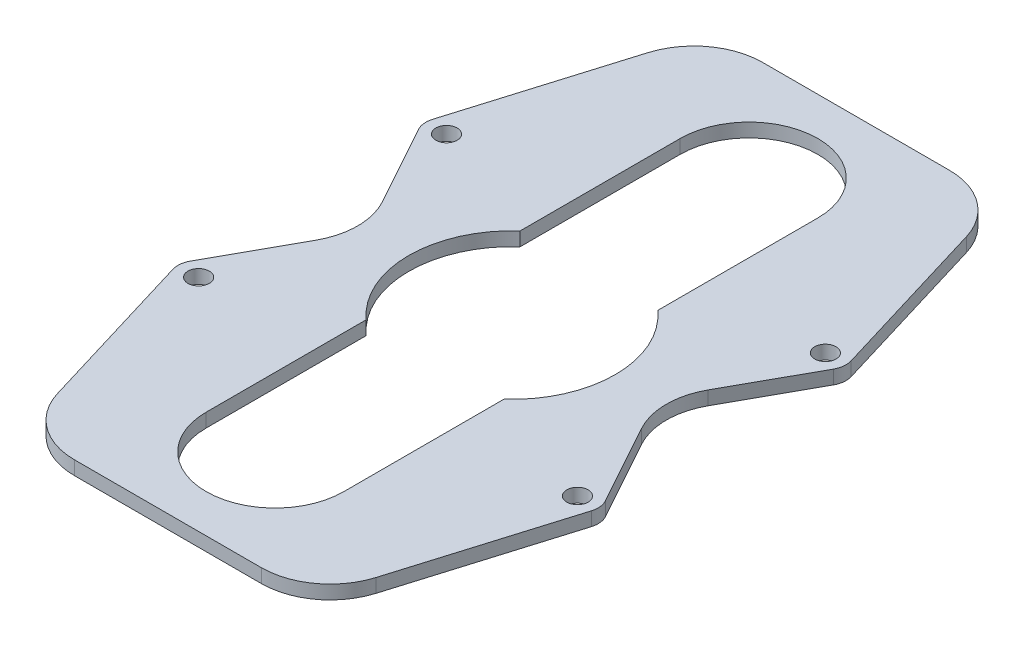
ISO-10303-21;
HEADER;
FILE_DESCRIPTION(('STEP AP214'),'2;1');
FILE_NAME('part.step','',(''),(''),'','','');
FILE_SCHEMA(('AUTOMOTIVE_DESIGN { 1 0 10303 214 1 1 1 1 }'));
ENDSEC;
DATA;
#1=APPLICATION_CONTEXT('core data for automotive mechanical design processes');
#2=APPLICATION_PROTOCOL_DEFINITION('international standard','automotive_design',2000,#1);
#3=PRODUCT_CONTEXT('',#1,'mechanical');
#4=PRODUCT('Part','Part','',(#3));
#5=PRODUCT_RELATED_PRODUCT_CATEGORY('part','',(#4));
#6=PRODUCT_DEFINITION_FORMATION('','',#4);
#7=PRODUCT_DEFINITION_CONTEXT('part definition',#1,'design');
#8=PRODUCT_DEFINITION('design','',#6,#7);
#9=PRODUCT_DEFINITION_SHAPE('','',#8);
#10=(LENGTH_UNIT() NAMED_UNIT(*) SI_UNIT(.MILLI.,.METRE.));
#11=(NAMED_UNIT(*) PLANE_ANGLE_UNIT() SI_UNIT($,.RADIAN.));
#12=(NAMED_UNIT(*) SI_UNIT($,.STERADIAN.) SOLID_ANGLE_UNIT());
#13=UNCERTAINTY_MEASURE_WITH_UNIT(LENGTH_MEASURE(1.E-05),#10,'distance_accuracy_value','');
#14=(GEOMETRIC_REPRESENTATION_CONTEXT(3) GLOBAL_UNCERTAINTY_ASSIGNED_CONTEXT((#13)) GLOBAL_UNIT_ASSIGNED_CONTEXT((#10,
#11,#12)) REPRESENTATION_CONTEXT('',''));
#15=CARTESIAN_POINT('',(0.,0.,0.));
#16=DIRECTION('',(0.,0.,1.));
#17=DIRECTION('',(1.,0.,0.));
#18=AXIS2_PLACEMENT_3D('',#15,#16,#17);
#19=CARTESIAN_POINT('',(-13.5734358663279,2.,-40.));
#20=DIRECTION('',(0.,1.,0.));
#21=DIRECTION('',(0.,0.,1.));
#22=AXIS2_PLACEMENT_3D('',#19,#20,#21);
#23=PLANE('',#22);
#24=CARTESIAN_POINT('',(27.525,2.,18.01));
#25=DIRECTION('',(0.,1.,0.));
#26=DIRECTION('',(0.,0.,1.));
#27=AXIS2_PLACEMENT_3D('',#24,#25,#26);
#28=CIRCLE('',#27,1.55);
#29=CARTESIAN_POINT('',(27.525,2.,19.56));
#30=VERTEX_POINT('',#29);
#31=EDGE_CURVE('E832',#30,#30,#28,.T.);
#32=ORIENTED_EDGE('',*,*,#31,.F.);
#33=EDGE_LOOP('',(#32));
#34=FACE_BOUND('',#33,.T.);
#35=CARTESIAN_POINT('',(-27.525,2.,-18.01));
#36=DIRECTION('',(0.,1.,0.));
#37=DIRECTION('',(0.,0.,1.));
#38=AXIS2_PLACEMENT_3D('',#35,#36,#37);
#39=CIRCLE('',#38,1.55);
#40=CARTESIAN_POINT('',(-27.525,2.,-16.46));
#41=VERTEX_POINT('',#40);
#42=EDGE_CURVE('E672',#41,#41,#39,.T.);
#43=ORIENTED_EDGE('',*,*,#42,.F.);
#44=EDGE_LOOP('',(#43));
#45=FACE_BOUND('',#44,.T.);
#46=CARTESIAN_POINT('',(-13.5734358663279,2.,-40.));
#47=DIRECTION('',(0.,1.,0.));
#48=DIRECTION('',(0.,0.,1.));
#49=AXIS2_PLACEMENT_3D('',#46,#47,#48);
#50=CIRCLE('',#49,10.);
#51=CARTESIAN_POINT('',(-13.5734358663279,2.,-50.));
#52=VERTEX_POINT('',#51);
#53=CARTESIAN_POINT('',(-23.1465968319195,2.,-42.8904306127067));
#54=VERTEX_POINT('',#53);
#55=EDGE_CURVE('E678',#52,#54,#50,.T.);
#56=ORIENTED_EDGE('',*,*,#55,.T.);
#57=DIRECTION('',(0.289043061270665,0.,-0.957316096559168));
#58=VECTOR('',#57,1.);
#59=CARTESIAN_POINT('',(-30.3969482896775,2.,-18.877129183812));
#60=LINE('',#59,#58);
#61=CARTESIAN_POINT('',(-30.3969482896775,2.,-18.877129183812));
#62=VERTEX_POINT('',#61);
#63=EDGE_CURVE('E680',#62,#54,#60,.T.);
#64=ORIENTED_EDGE('',*,*,#63,.F.);
#65=CARTESIAN_POINT('',(-27.525,2.,-18.01));
#66=DIRECTION('',(0.,-1.,0.));
#67=DIRECTION('',(0.,0.,-1.));
#68=AXIS2_PLACEMENT_3D('',#65,#66,#67);
#69=CIRCLE('',#68,3.);
#70=CARTESIAN_POINT('',(-30.1507426954991,2.,-16.5589743982159));
#71=VERTEX_POINT('',#70);
#72=EDGE_CURVE('E684',#71,#62,#69,.T.);
#73=ORIENTED_EDGE('',*,*,#72,.F.);
#74=DIRECTION('',(0.483675200594704,0.,0.875247565166378));
#75=VECTOR('',#74,1.);
#76=CARTESIAN_POINT('',(-30.1507426954991,2.,-16.5589743982159));
#77=LINE('',#76,#75);
#78=CARTESIAN_POINT('',(-23.6728631872955,2.,-4.83675200594703));
#79=VERTEX_POINT('',#78);
#80=EDGE_CURVE('E687',#71,#79,#77,.T.);
#81=ORIENTED_EDGE('',*,*,#80,.T.);
#82=CARTESIAN_POINT('',(-32.4253388389593,2.,0.));
#83=DIRECTION('',(0.,1.,0.));
#84=DIRECTION('',(0.,0.,1.));
#85=AXIS2_PLACEMENT_3D('',#82,#83,#84);
#86=CIRCLE('',#85,10.);
#87=CARTESIAN_POINT('',(-23.6728631872955,2.,4.83675200594704));
#88=VERTEX_POINT('',#87);
#89=EDGE_CURVE('E689',#88,#79,#86,.T.);
#90=ORIENTED_EDGE('',*,*,#89,.F.);
#91=DIRECTION('',(0.483675200594705,0.,-0.875247565166377));
#92=VECTOR('',#91,1.);
#93=CARTESIAN_POINT('',(-30.1507426954991,2.,16.5589743982159));
#94=LINE('',#93,#92);
#95=CARTESIAN_POINT('',(-30.1507426954991,2.,16.5589743982159));
#96=VERTEX_POINT('',#95);
#97=EDGE_CURVE('E692',#96,#88,#94,.T.);
#98=ORIENTED_EDGE('',*,*,#97,.F.);
#99=CARTESIAN_POINT('',(-27.525,2.,18.01));
#100=DIRECTION('',(0.,-1.,0.));
#101=DIRECTION('',(0.,0.,-1.));
#102=AXIS2_PLACEMENT_3D('',#99,#100,#101);
#103=CIRCLE('',#102,3.00000000000001);
#104=CARTESIAN_POINT('',(-30.3969482896775,2.,18.877129183812));
#105=VERTEX_POINT('',#104);
#106=EDGE_CURVE('E695',#105,#96,#103,.T.);
#107=ORIENTED_EDGE('',*,*,#106,.F.);
#108=DIRECTION('',(0.289043061270665,0.,0.957316096559168));
#109=VECTOR('',#108,1.);
#110=CARTESIAN_POINT('',(-30.3969482896775,2.,18.877129183812));
#111=LINE('',#110,#109);
#112=CARTESIAN_POINT('',(-23.1465968319195,2.,42.8904306127067));
#113=VERTEX_POINT('',#112);
#114=EDGE_CURVE('E698',#105,#113,#111,.T.);
#115=ORIENTED_EDGE('',*,*,#114,.T.);
#116=CARTESIAN_POINT('',(-13.5734358663279,2.,40.));
#117=DIRECTION('',(0.,1.,0.));
#118=DIRECTION('',(0.,0.,1.));
#119=AXIS2_PLACEMENT_3D('',#116,#117,#118);
#120=CIRCLE('',#119,10.);
#121=CARTESIAN_POINT('',(-13.5734358663279,2.,50.));
#122=VERTEX_POINT('',#121);
#123=EDGE_CURVE('E700',#113,#122,#120,.T.);
#124=ORIENTED_EDGE('',*,*,#123,.T.);
#125=DIRECTION('',(1.,0.,0.));
#126=VECTOR('',#125,1.);
#127=CARTESIAN_POINT('',(-13.5734358663279,2.,50.));
#128=LINE('',#127,#126);
#129=CARTESIAN_POINT('',(13.5734358663279,2.,50.));
#130=VERTEX_POINT('',#129);
#131=EDGE_CURVE('E702',#122,#130,#128,.T.);
#132=ORIENTED_EDGE('',*,*,#131,.T.);
#133=CARTESIAN_POINT('',(13.5734358663279,2.,40.));
#134=DIRECTION('',(0.,1.,0.));
#135=DIRECTION('',(0.,0.,1.));
#136=AXIS2_PLACEMENT_3D('',#133,#134,#135);
#137=CIRCLE('',#136,10.);
#138=CARTESIAN_POINT('',(23.1465968319195,2.,42.8904306127067));
#139=VERTEX_POINT('',#138);
#140=EDGE_CURVE('E704',#130,#139,#137,.T.);
#141=ORIENTED_EDGE('',*,*,#140,.T.);
#142=DIRECTION('',(-0.289043061270665,0.,0.957316096559168));
#143=VECTOR('',#142,1.);
#144=CARTESIAN_POINT('',(30.3969482896775,2.,18.877129183812));
#145=LINE('',#144,#143);
#146=CARTESIAN_POINT('',(30.3969482896775,2.,18.877129183812));
#147=VERTEX_POINT('',#146);
#148=EDGE_CURVE('E706',#147,#139,#145,.T.);
#149=ORIENTED_EDGE('',*,*,#148,.F.);
#150=CARTESIAN_POINT('',(27.525,2.,18.01));
#151=DIRECTION('',(0.,1.,0.));
#152=DIRECTION('',(0.,0.,1.));
#153=AXIS2_PLACEMENT_3D('',#150,#151,#152);
#154=CIRCLE('',#153,3.00000000000004);
#155=CARTESIAN_POINT('',(30.1507426954991,2.,16.5589743982159));
#156=VERTEX_POINT('',#155);
#157=EDGE_CURVE('E709',#147,#156,#154,.T.);
#158=ORIENTED_EDGE('',*,*,#157,.T.);
#159=DIRECTION('',(-0.483675200594704,0.,-0.875247565166378));
#160=VECTOR('',#159,1.);
#161=CARTESIAN_POINT('',(30.1507426954991,2.,16.5589743982159));
#162=LINE('',#161,#160);
#163=CARTESIAN_POINT('',(23.6728631872956,2.,4.83675200594705));
#164=VERTEX_POINT('',#163);
#165=EDGE_CURVE('E711',#156,#164,#162,.T.);
#166=ORIENTED_EDGE('',*,*,#165,.T.);
#167=CARTESIAN_POINT('',(32.4253388389593,2.,0.));
#168=DIRECTION('',(0.,-1.,0.));
#169=DIRECTION('',(0.,0.,-1.));
#170=AXIS2_PLACEMENT_3D('',#167,#168,#169);
#171=CIRCLE('',#170,9.99999999999999);
#172=CARTESIAN_POINT('',(23.6728631872956,2.,-4.83675200594705));
#173=VERTEX_POINT('',#172);
#174=EDGE_CURVE('E713',#164,#173,#171,.T.);
#175=ORIENTED_EDGE('',*,*,#174,.T.);
#176=DIRECTION('',(-0.483675200594704,0.,0.875247565166378));
#177=VECTOR('',#176,1.);
#178=CARTESIAN_POINT('',(30.1507426954992,2.,-16.5589743982159));
#179=LINE('',#178,#177);
#180=CARTESIAN_POINT('',(30.1507426954992,2.,-16.5589743982159));
#181=VERTEX_POINT('',#180);
#182=EDGE_CURVE('E715',#181,#173,#179,.T.);
#183=ORIENTED_EDGE('',*,*,#182,.F.);
#184=CARTESIAN_POINT('',(27.525,2.,-18.01));
#185=DIRECTION('',(0.,1.,0.));
#186=DIRECTION('',(0.,0.,1.));
#187=AXIS2_PLACEMENT_3D('',#184,#185,#186);
#188=CIRCLE('',#187,3.00000000000004);
#189=CARTESIAN_POINT('',(30.3969482896775,2.,-18.877129183812));
#190=VERTEX_POINT('',#189);
#191=EDGE_CURVE('E718',#181,#190,#188,.T.);
#192=ORIENTED_EDGE('',*,*,#191,.T.);
#193=DIRECTION('',(-0.289043061270665,0.,-0.957316096559168));
#194=VECTOR('',#193,1.);
#195=CARTESIAN_POINT('',(30.3969482896775,2.,-18.877129183812));
#196=LINE('',#195,#194);
#197=CARTESIAN_POINT('',(23.1465968319195,2.,-42.8904306127067));
#198=VERTEX_POINT('',#197);
#199=EDGE_CURVE('E720',#190,#198,#196,.T.);
#200=ORIENTED_EDGE('',*,*,#199,.T.);
#201=CARTESIAN_POINT('',(13.5734358663279,2.,-40.));
#202=DIRECTION('',(0.,-1.,0.));
#203=DIRECTION('',(0.,0.,-1.));
#204=AXIS2_PLACEMENT_3D('',#201,#202,#203);
#205=CIRCLE('',#204,10.);
#206=CARTESIAN_POINT('',(13.5734358663279,2.,-50.));
#207=VERTEX_POINT('',#206);
#208=EDGE_CURVE('E722',#207,#198,#205,.T.);
#209=ORIENTED_EDGE('',*,*,#208,.F.);
#210=DIRECTION('',(1.,0.,0.));
#211=VECTOR('',#210,1.);
#212=CARTESIAN_POINT('',(-13.5734358663279,2.,-50.));
#213=LINE('',#212,#211);
#214=EDGE_CURVE('E725',#52,#207,#213,.T.);
#215=ORIENTED_EDGE('',*,*,#214,.F.);
#216=EDGE_LOOP('',(#56,#64,#73,#81,#90,#98,#107,#115,#124,#132,#141,#149,#158,#166,#175,#183,
#192,#200,#209,#215));
#217=FACE_BOUND('',#216,.T.);
#218=CARTESIAN_POINT('',(-27.525,2.,18.01));
#219=DIRECTION('',(0.,1.,0.));
#220=DIRECTION('',(0.,0.,1.));
#221=AXIS2_PLACEMENT_3D('',#218,#219,#220);
#222=CIRCLE('',#221,1.55);
#223=CARTESIAN_POINT('',(-27.525,2.,19.56));
#224=VERTEX_POINT('',#223);
#225=EDGE_CURVE('E666',#224,#224,#222,.T.);
#226=ORIENTED_EDGE('',*,*,#225,.F.);
#227=EDGE_LOOP('',(#226));
#228=FACE_BOUND('',#227,.T.);
#229=DIRECTION('',(0.,0.,-1.));
#230=VECTOR('',#229,1.);
#231=CARTESIAN_POINT('',(-9.99999999999999,2.,34.438564591906));
#232=LINE('',#231,#230);
#233=CARTESIAN_POINT('',(-9.99999999999999,2.,34.438564591906));
#234=VERTEX_POINT('',#233);
#235=CARTESIAN_POINT('',(-9.99999999999999,2.,11.180339887499));
#236=VERTEX_POINT('',#235);
#237=EDGE_CURVE('E658',#234,#236,#232,.T.);
#238=ORIENTED_EDGE('',*,*,#237,.T.);
#239=CARTESIAN_POINT('',(0.,2.,0.));
#240=DIRECTION('',(0.,1.,0.));
#241=DIRECTION('',(0.,0.,1.));
#242=AXIS2_PLACEMENT_3D('',#239,#240,#241);
#243=CIRCLE('',#242,15.);
#244=CARTESIAN_POINT('',(-9.99999999999999,2.,-11.180339887499));
#245=VERTEX_POINT('',#244);
#246=EDGE_CURVE('E457',#245,#236,#243,.T.);
#247=ORIENTED_EDGE('',*,*,#246,.F.);
#248=CARTESIAN_POINT('',(-9.99999999999999,2.,-34.438564591906));
#249=VERTEX_POINT('',#248);
#250=EDGE_CURVE('E849',#245,#249,#232,.T.);
#251=ORIENTED_EDGE('',*,*,#250,.T.);
#252=CARTESIAN_POINT('',(0.,2.,-34.438564591906));
#253=DIRECTION('',(0.,1.,0.));
#254=DIRECTION('',(0.,0.,1.));
#255=AXIS2_PLACEMENT_3D('',#252,#253,#254);
#256=CIRCLE('',#255,9.99999999999999);
#257=CARTESIAN_POINT('',(9.99999999999999,2.,-34.438564591906));
#258=VERTEX_POINT('',#257);
#259=EDGE_CURVE('E845',#258,#249,#256,.T.);
#260=ORIENTED_EDGE('',*,*,#259,.F.);
#261=DIRECTION('',(0.,0.,-1.));
#262=VECTOR('',#261,1.);
#263=CARTESIAN_POINT('',(9.99999999999999,2.,34.438564591906));
#264=LINE('',#263,#262);
#265=CARTESIAN_POINT('',(9.99999999999999,2.,-11.180339887499));
#266=VERTEX_POINT('',#265);
#267=EDGE_CURVE('E846',#266,#258,#264,.T.);
#268=ORIENTED_EDGE('',*,*,#267,.F.);
#269=CARTESIAN_POINT('',(9.99999999999999,2.,11.180339887499));
#270=VERTEX_POINT('',#269);
#271=EDGE_CURVE('E620',#270,#266,#243,.T.);
#272=ORIENTED_EDGE('',*,*,#271,.F.);
#273=CARTESIAN_POINT('',(9.99999999999999,2.,34.438564591906));
#274=VERTEX_POINT('',#273);
#275=EDGE_CURVE('E842',#274,#270,#264,.T.);
#276=ORIENTED_EDGE('',*,*,#275,.F.);
#277=CARTESIAN_POINT('',(0.,2.,34.438564591906));
#278=DIRECTION('',(0.,1.,0.));
#279=DIRECTION('',(0.,0.,1.));
#280=AXIS2_PLACEMENT_3D('',#277,#278,#279);
#281=CIRCLE('',#280,9.99999999999999);
#282=EDGE_CURVE('E653',#234,#274,#281,.T.);
#283=ORIENTED_EDGE('',*,*,#282,.F.);
#284=EDGE_LOOP('',(#238,#247,#251,#260,#268,#272,#276,#283));
#285=FACE_BOUND('',#284,.T.);
#286=CARTESIAN_POINT('',(27.525,2.,-18.01));
#287=DIRECTION('',(0.,1.,0.));
#288=DIRECTION('',(0.,0.,1.));
#289=AXIS2_PLACEMENT_3D('',#286,#287,#288);
#290=CIRCLE('',#289,1.55);
#291=CARTESIAN_POINT('',(27.525,2.,-16.46));
#292=VERTEX_POINT('',#291);
#293=EDGE_CURVE('E1241',#292,#292,#290,.T.);
#294=ORIENTED_EDGE('',*,*,#293,.F.);
#295=EDGE_LOOP('',(#294));
#296=FACE_BOUND('',#295,.T.);
#297=ADVANCED_FACE('F435',(#34,#45,#217,#228,#285,#296),#23,.T.);
#298=CARTESIAN_POINT('',(-13.5734358663279,0.,-40.));
#299=DIRECTION('',(0.,1.,0.));
#300=DIRECTION('',(0.,0.,1.));
#301=AXIS2_PLACEMENT_3D('',#298,#299,#300);
#302=PLANE('',#301);
#303=CARTESIAN_POINT('',(-27.525,0.,18.01));
#304=DIRECTION('',(0.,1.,0.));
#305=DIRECTION('',(0.,0.,1.));
#306=AXIS2_PLACEMENT_3D('',#303,#304,#305);
#307=CIRCLE('',#306,1.55);
#308=CARTESIAN_POINT('',(-27.525,0.,19.56));
#309=VERTEX_POINT('',#308);
#310=EDGE_CURVE('E665',#309,#309,#307,.T.);
#311=ORIENTED_EDGE('',*,*,#310,.T.);
#312=EDGE_LOOP('',(#311));
#313=FACE_BOUND('',#312,.T.);
#314=CARTESIAN_POINT('',(-27.525,0.,-18.01));
#315=DIRECTION('',(0.,1.,0.));
#316=DIRECTION('',(0.,0.,1.));
#317=AXIS2_PLACEMENT_3D('',#314,#315,#316);
#318=CIRCLE('',#317,1.55);
#319=CARTESIAN_POINT('',(-27.525,0.,-16.46));
#320=VERTEX_POINT('',#319);
#321=EDGE_CURVE('E669',#320,#320,#318,.T.);
#322=ORIENTED_EDGE('',*,*,#321,.T.);
#323=EDGE_LOOP('',(#322));
#324=FACE_BOUND('',#323,.T.);
#325=CARTESIAN_POINT('',(-13.5734358663279,0.,-40.));
#326=DIRECTION('',(0.,1.,0.));
#327=DIRECTION('',(0.,0.,1.));
#328=AXIS2_PLACEMENT_3D('',#325,#326,#327);
#329=CIRCLE('',#328,10.);
#330=CARTESIAN_POINT('',(-13.5734358663279,0.,-50.));
#331=VERTEX_POINT('',#330);
#332=CARTESIAN_POINT('',(-23.1465968319195,0.,-42.8904306127067));
#333=VERTEX_POINT('',#332);
#334=EDGE_CURVE('E675',#331,#333,#329,.T.);
#335=ORIENTED_EDGE('',*,*,#334,.F.);
#336=DIRECTION('',(1.,0.,0.));
#337=VECTOR('',#336,1.);
#338=CARTESIAN_POINT('',(-13.5734358663279,0.,-50.));
#339=LINE('',#338,#337);
#340=CARTESIAN_POINT('',(13.5734358663279,0.,-50.));
#341=VERTEX_POINT('',#340);
#342=EDGE_CURVE('E681',#331,#341,#339,.T.);
#343=ORIENTED_EDGE('',*,*,#342,.T.);
#344=CARTESIAN_POINT('',(13.5734358663279,0.,-40.));
#345=DIRECTION('',(0.,-1.,0.));
#346=DIRECTION('',(0.,0.,-1.));
#347=AXIS2_PLACEMENT_3D('',#344,#345,#346);
#348=CIRCLE('',#347,10.);
#349=CARTESIAN_POINT('',(23.1465968319195,0.,-42.8904306127067));
#350=VERTEX_POINT('',#349);
#351=EDGE_CURVE('E776',#341,#350,#348,.T.);
#352=ORIENTED_EDGE('',*,*,#351,.T.);
#353=DIRECTION('',(-0.289043061270665,0.,-0.957316096559168));
#354=VECTOR('',#353,1.);
#355=CARTESIAN_POINT('',(30.3969482896775,0.,-18.877129183812));
#356=LINE('',#355,#354);
#357=CARTESIAN_POINT('',(30.3969482896775,0.,-18.877129183812));
#358=VERTEX_POINT('',#357);
#359=EDGE_CURVE('E773',#358,#350,#356,.T.);
#360=ORIENTED_EDGE('',*,*,#359,.F.);
#361=CARTESIAN_POINT('',(27.525,0.,-18.01));
#362=DIRECTION('',(0.,1.,0.));
#363=DIRECTION('',(0.,0.,1.));
#364=AXIS2_PLACEMENT_3D('',#361,#362,#363);
#365=CIRCLE('',#364,3.00000000000004);
#366=CARTESIAN_POINT('',(30.1507426954992,0.,-16.5589743982159));
#367=VERTEX_POINT('',#366);
#368=EDGE_CURVE('E771',#367,#358,#365,.T.);
#369=ORIENTED_EDGE('',*,*,#368,.F.);
#370=DIRECTION('',(-0.483675200594704,0.,0.875247565166378));
#371=VECTOR('',#370,1.);
#372=CARTESIAN_POINT('',(30.1507426954992,0.,-16.5589743982159));
#373=LINE('',#372,#371);
#374=CARTESIAN_POINT('',(23.6728631872956,0.,-4.83675200594705));
#375=VERTEX_POINT('',#374);
#376=EDGE_CURVE('E768',#367,#375,#373,.T.);
#377=ORIENTED_EDGE('',*,*,#376,.T.);
#378=CARTESIAN_POINT('',(32.4253388389593,0.,0.));
#379=DIRECTION('',(0.,-1.,0.));
#380=DIRECTION('',(0.,0.,-1.));
#381=AXIS2_PLACEMENT_3D('',#378,#379,#380);
#382=CIRCLE('',#381,9.99999999999999);
#383=CARTESIAN_POINT('',(23.6728631872956,0.,4.83675200594705));
#384=VERTEX_POINT('',#383);
#385=EDGE_CURVE('E765',#384,#375,#382,.T.);
#386=ORIENTED_EDGE('',*,*,#385,.F.);
#387=DIRECTION('',(-0.483675200594704,0.,-0.875247565166378));
#388=VECTOR('',#387,1.);
#389=CARTESIAN_POINT('',(30.1507426954991,0.,16.5589743982159));
#390=LINE('',#389,#388);
#391=CARTESIAN_POINT('',(30.1507426954991,0.,16.5589743982159));
#392=VERTEX_POINT('',#391);
#393=EDGE_CURVE('E763',#392,#384,#390,.T.);
#394=ORIENTED_EDGE('',*,*,#393,.F.);
#395=CARTESIAN_POINT('',(27.525,0.,18.01));
#396=DIRECTION('',(0.,1.,0.));
#397=DIRECTION('',(0.,0.,1.));
#398=AXIS2_PLACEMENT_3D('',#395,#396,#397);
#399=CIRCLE('',#398,3.00000000000004);
#400=CARTESIAN_POINT('',(30.3969482896775,0.,18.877129183812));
#401=VERTEX_POINT('',#400);
#402=EDGE_CURVE('E761',#401,#392,#399,.T.);
#403=ORIENTED_EDGE('',*,*,#402,.F.);
#404=DIRECTION('',(-0.289043061270665,0.,0.957316096559168));
#405=VECTOR('',#404,1.);
#406=CARTESIAN_POINT('',(30.3969482896775,0.,18.877129183812));
#407=LINE('',#406,#405);
#408=CARTESIAN_POINT('',(23.1465968319195,0.,42.8904306127067));
#409=VERTEX_POINT('',#408);
#410=EDGE_CURVE('E758',#401,#409,#407,.T.);
#411=ORIENTED_EDGE('',*,*,#410,.T.);
#412=CARTESIAN_POINT('',(13.5734358663279,0.,40.));
#413=DIRECTION('',(0.,1.,0.));
#414=DIRECTION('',(0.,0.,1.));
#415=AXIS2_PLACEMENT_3D('',#412,#413,#414);
#416=CIRCLE('',#415,10.);
#417=CARTESIAN_POINT('',(13.5734358663279,0.,50.));
#418=VERTEX_POINT('',#417);
#419=EDGE_CURVE('E755',#418,#409,#416,.T.);
#420=ORIENTED_EDGE('',*,*,#419,.F.);
#421=DIRECTION('',(1.,0.,0.));
#422=VECTOR('',#421,1.);
#423=CARTESIAN_POINT('',(-13.5734358663279,0.,50.));
#424=LINE('',#423,#422);
#425=CARTESIAN_POINT('',(-13.5734358663279,0.,50.));
#426=VERTEX_POINT('',#425);
#427=EDGE_CURVE('E753',#426,#418,#424,.T.);
#428=ORIENTED_EDGE('',*,*,#427,.F.);
#429=CARTESIAN_POINT('',(-13.5734358663279,0.,40.));
#430=DIRECTION('',(0.,1.,0.));
#431=DIRECTION('',(0.,0.,1.));
#432=AXIS2_PLACEMENT_3D('',#429,#430,#431);
#433=CIRCLE('',#432,10.);
#434=CARTESIAN_POINT('',(-23.1465968319195,0.,42.8904306127067));
#435=VERTEX_POINT('',#434);
#436=EDGE_CURVE('E751',#435,#426,#433,.T.);
#437=ORIENTED_EDGE('',*,*,#436,.F.);
#438=DIRECTION('',(0.289043061270665,0.,0.957316096559168));
#439=VECTOR('',#438,1.);
#440=CARTESIAN_POINT('',(-30.3969482896775,0.,18.877129183812));
#441=LINE('',#440,#439);
#442=CARTESIAN_POINT('',(-30.3969482896775,0.,18.877129183812));
#443=VERTEX_POINT('',#442);
#444=EDGE_CURVE('E749',#443,#435,#441,.T.);
#445=ORIENTED_EDGE('',*,*,#444,.F.);
#446=CARTESIAN_POINT('',(-27.525,0.,18.01));
#447=DIRECTION('',(0.,-1.,0.));
#448=DIRECTION('',(0.,0.,-1.));
#449=AXIS2_PLACEMENT_3D('',#446,#447,#448);
#450=CIRCLE('',#449,3.00000000000001);
#451=CARTESIAN_POINT('',(-30.1507426954991,0.,16.5589743982159));
#452=VERTEX_POINT('',#451);
#453=EDGE_CURVE('E746',#443,#452,#450,.T.);
#454=ORIENTED_EDGE('',*,*,#453,.T.);
#455=DIRECTION('',(0.483675200594705,0.,-0.875247565166377));
#456=VECTOR('',#455,1.);
#457=CARTESIAN_POINT('',(-30.1507426954991,0.,16.5589743982159));
#458=LINE('',#457,#456);
#459=CARTESIAN_POINT('',(-23.6728631872955,0.,4.83675200594704));
#460=VERTEX_POINT('',#459);
#461=EDGE_CURVE('E743',#452,#460,#458,.T.);
#462=ORIENTED_EDGE('',*,*,#461,.T.);
#463=CARTESIAN_POINT('',(-32.4253388389593,0.,0.));
#464=DIRECTION('',(0.,1.,0.));
#465=DIRECTION('',(0.,0.,1.));
#466=AXIS2_PLACEMENT_3D('',#463,#464,#465);
#467=CIRCLE('',#466,10.);
#468=CARTESIAN_POINT('',(-23.6728631872955,0.,-4.83675200594703));
#469=VERTEX_POINT('',#468);
#470=EDGE_CURVE('E740',#460,#469,#467,.T.);
#471=ORIENTED_EDGE('',*,*,#470,.T.);
#472=DIRECTION('',(0.483675200594704,0.,0.875247565166378));
#473=VECTOR('',#472,1.);
#474=CARTESIAN_POINT('',(-30.1507426954991,0.,-16.5589743982159));
#475=LINE('',#474,#473);
#476=CARTESIAN_POINT('',(-30.1507426954991,0.,-16.5589743982159));
#477=VERTEX_POINT('',#476);
#478=EDGE_CURVE('E737',#477,#469,#475,.T.);
#479=ORIENTED_EDGE('',*,*,#478,.F.);
#480=CARTESIAN_POINT('',(-27.525,0.,-18.01));
#481=DIRECTION('',(0.,-1.,0.));
#482=DIRECTION('',(0.,0.,-1.));
#483=AXIS2_PLACEMENT_3D('',#480,#481,#482);
#484=CIRCLE('',#483,3.);
#485=CARTESIAN_POINT('',(-30.3969482896775,0.,-18.877129183812));
#486=VERTEX_POINT('',#485);
#487=EDGE_CURVE('E734',#477,#486,#484,.T.);
#488=ORIENTED_EDGE('',*,*,#487,.T.);
#489=DIRECTION('',(0.289043061270665,0.,-0.957316096559168));
#490=VECTOR('',#489,1.);
#491=CARTESIAN_POINT('',(-30.3969482896775,0.,-18.877129183812));
#492=LINE('',#491,#490);
#493=EDGE_CURVE('E731',#486,#333,#492,.T.);
#494=ORIENTED_EDGE('',*,*,#493,.T.);
#495=EDGE_LOOP('',(#335,#343,#352,#360,#369,#377,#386,#394,#403,#411,#420,#428,#437,#445,#454,
#462,#471,#479,#488,#494));
#496=FACE_BOUND('',#495,.T.);
#497=CARTESIAN_POINT('',(0.,0.,0.));
#498=DIRECTION('',(0.,1.,0.));
#499=DIRECTION('',(0.,0.,1.));
#500=AXIS2_PLACEMENT_3D('',#497,#498,#499);
#501=CIRCLE('',#500,15.);
#502=CARTESIAN_POINT('',(-9.99999999999999,0.,-11.180339887499));
#503=VERTEX_POINT('',#502);
#504=CARTESIAN_POINT('',(-9.99999999999999,0.,11.180339887499));
#505=VERTEX_POINT('',#504);
#506=EDGE_CURVE('E637',#503,#505,#501,.T.);
#507=ORIENTED_EDGE('',*,*,#506,.T.);
#508=DIRECTION('',(0.,0.,-1.));
#509=VECTOR('',#508,1.);
#510=CARTESIAN_POINT('',(-9.99999999999999,0.,34.438564591906));
#511=LINE('',#510,#509);
#512=CARTESIAN_POINT('',(-9.99999999999999,0.,34.438564591906));
#513=VERTEX_POINT('',#512);
#514=EDGE_CURVE('E650',#513,#505,#511,.T.);
#515=ORIENTED_EDGE('',*,*,#514,.F.);
#516=CARTESIAN_POINT('',(0.,0.,34.438564591906));
#517=DIRECTION('',(0.,1.,0.));
#518=DIRECTION('',(0.,0.,1.));
#519=AXIS2_PLACEMENT_3D('',#516,#517,#518);
#520=CIRCLE('',#519,9.99999999999999);
#521=CARTESIAN_POINT('',(9.99999999999999,0.,34.438564591906));
#522=VERTEX_POINT('',#521);
#523=EDGE_CURVE('E624',#513,#522,#520,.T.);
#524=ORIENTED_EDGE('',*,*,#523,.T.);
#525=DIRECTION('',(0.,0.,-1.));
#526=VECTOR('',#525,1.);
#527=CARTESIAN_POINT('',(9.99999999999999,0.,34.438564591906));
#528=LINE('',#527,#526);
#529=CARTESIAN_POINT('',(9.99999999999999,0.,11.180339887499));
#530=VERTEX_POINT('',#529);
#531=EDGE_CURVE('E636',#522,#530,#528,.T.);
#532=ORIENTED_EDGE('',*,*,#531,.T.);
#533=CARTESIAN_POINT('',(9.99999999999999,0.,-11.180339887499));
#534=VERTEX_POINT('',#533);
#535=EDGE_CURVE('E450',#530,#534,#501,.T.);
#536=ORIENTED_EDGE('',*,*,#535,.T.);
#537=CARTESIAN_POINT('',(9.99999999999999,0.,-34.438564591906));
#538=VERTEX_POINT('',#537);
#539=EDGE_CURVE('E633',#534,#538,#528,.T.);
#540=ORIENTED_EDGE('',*,*,#539,.T.);
#541=CARTESIAN_POINT('',(0.,0.,-34.438564591906));
#542=DIRECTION('',(0.,1.,0.));
#543=DIRECTION('',(0.,0.,1.));
#544=AXIS2_PLACEMENT_3D('',#541,#542,#543);
#545=CIRCLE('',#544,9.99999999999999);
#546=CARTESIAN_POINT('',(-9.99999999999999,0.,-34.438564591906));
#547=VERTEX_POINT('',#546);
#548=EDGE_CURVE('E644',#538,#547,#545,.T.);
#549=ORIENTED_EDGE('',*,*,#548,.T.);
#550=EDGE_CURVE('E649',#503,#547,#511,.T.);
#551=ORIENTED_EDGE('',*,*,#550,.F.);
#552=EDGE_LOOP('',(#507,#515,#524,#532,#536,#540,#549,#551));
#553=FACE_BOUND('',#552,.T.);
#554=CARTESIAN_POINT('',(27.525,0.,18.01));
#555=DIRECTION('',(0.,1.,0.));
#556=DIRECTION('',(0.,0.,1.));
#557=AXIS2_PLACEMENT_3D('',#554,#555,#556);
#558=CIRCLE('',#557,1.55);
#559=CARTESIAN_POINT('',(27.525,0.,19.56));
#560=VERTEX_POINT('',#559);
#561=EDGE_CURVE('E1247',#560,#560,#558,.T.);
#562=ORIENTED_EDGE('',*,*,#561,.T.);
#563=EDGE_LOOP('',(#562));
#564=FACE_BOUND('',#563,.T.);
#565=CARTESIAN_POINT('',(27.525,0.,-18.01));
#566=DIRECTION('',(0.,1.,0.));
#567=DIRECTION('',(0.,0.,1.));
#568=AXIS2_PLACEMENT_3D('',#565,#566,#567);
#569=CIRCLE('',#568,1.55);
#570=CARTESIAN_POINT('',(27.525,0.,-16.46));
#571=VERTEX_POINT('',#570);
#572=EDGE_CURVE('E1244',#571,#571,#569,.T.);
#573=ORIENTED_EDGE('',*,*,#572,.T.);
#574=EDGE_LOOP('',(#573));
#575=FACE_BOUND('',#574,.T.);
#576=ADVANCED_FACE('F630',(#313,#324,#496,#553,#564,#575),#302,.F.);
#577=CARTESIAN_POINT('',(9.99999999999999,2.,34.438564591906));
#578=DIRECTION('',(-1.,0.,0.));
#579=DIRECTION('',(0.,0.,1.));
#580=AXIS2_PLACEMENT_3D('',#577,#578,#579);
#581=PLANE('',#580);
#582=ORIENTED_EDGE('',*,*,#539,.F.);
#583=DIRECTION('',(0.,-1.,0.));
#584=VECTOR('',#583,1.);
#585=CARTESIAN_POINT('',(9.99999999999999,2.,-11.180339887499));
#586=LINE('',#585,#584);
#587=EDGE_CURVE('E617',#534,#266,#586,.F.);
#588=ORIENTED_EDGE('',*,*,#587,.T.);
#589=ORIENTED_EDGE('',*,*,#267,.T.);
#590=DIRECTION('',(0.,-1.,0.));
#591=VECTOR('',#590,1.);
#592=CARTESIAN_POINT('',(9.99999999999999,2.,-34.438564591906));
#593=LINE('',#592,#591);
#594=EDGE_CURVE('E641',#258,#538,#593,.T.);
#595=ORIENTED_EDGE('',*,*,#594,.T.);
#596=EDGE_LOOP('',(#582,#588,#589,#595));
#597=FACE_BOUND('',#596,.T.);
#598=ADVANCED_FACE('F639',(#597),#581,.T.);
#599=ORIENTED_EDGE('',*,*,#275,.T.);
#600=DIRECTION('',(0.,-1.,0.));
#601=VECTOR('',#600,1.);
#602=CARTESIAN_POINT('',(9.99999999999999,2.,11.180339887499));
#603=LINE('',#602,#601);
#604=EDGE_CURVE('E625',#270,#530,#603,.T.);
#605=ORIENTED_EDGE('',*,*,#604,.T.);
#606=ORIENTED_EDGE('',*,*,#531,.F.);
#607=DIRECTION('',(0.,-1.,0.));
#608=VECTOR('',#607,1.);
#609=CARTESIAN_POINT('',(9.99999999999999,2.,34.438564591906));
#610=LINE('',#609,#608);
#611=EDGE_CURVE('E662',#274,#522,#610,.T.);
#612=ORIENTED_EDGE('',*,*,#611,.F.);
#613=EDGE_LOOP('',(#599,#605,#606,#612));
#614=FACE_BOUND('',#613,.T.);
#615=ADVANCED_FACE('F841',(#614),#581,.T.);
#616=CARTESIAN_POINT('',(-9.99999999999999,2.,34.438564591906));
#617=DIRECTION('',(-1.,0.,0.));
#618=DIRECTION('',(0.,0.,1.));
#619=AXIS2_PLACEMENT_3D('',#616,#617,#618);
#620=PLANE('',#619);
#621=DIRECTION('',(0.,-1.,0.));
#622=VECTOR('',#621,1.);
#623=CARTESIAN_POINT('',(-9.99999999999999,2.,-11.180339887499));
#624=LINE('',#623,#622);
#625=EDGE_CURVE('E12',#503,#245,#624,.F.);
#626=ORIENTED_EDGE('',*,*,#625,.F.);
#627=ORIENTED_EDGE('',*,*,#550,.T.);
#628=DIRECTION('',(0.,-1.,0.));
#629=VECTOR('',#628,1.);
#630=CARTESIAN_POINT('',(-9.99999999999999,2.,-34.438564591906));
#631=LINE('',#630,#629);
#632=EDGE_CURVE('E657',#249,#547,#631,.T.);
#633=ORIENTED_EDGE('',*,*,#632,.F.);
#634=ORIENTED_EDGE('',*,*,#250,.F.);
#635=EDGE_LOOP('',(#626,#627,#633,#634));
#636=FACE_BOUND('',#635,.T.);
#637=ADVANCED_FACE('F856',(#636),#620,.F.);
#638=DIRECTION('',(0.,-1.,0.));
#639=VECTOR('',#638,1.);
#640=CARTESIAN_POINT('',(-9.99999999999999,2.,11.180339887499));
#641=LINE('',#640,#639);
#642=EDGE_CURVE('E443',#236,#505,#641,.T.);
#643=ORIENTED_EDGE('',*,*,#642,.F.);
#644=ORIENTED_EDGE('',*,*,#237,.F.);
#645=DIRECTION('',(0.,-1.,0.));
#646=VECTOR('',#645,1.);
#647=CARTESIAN_POINT('',(-9.99999999999999,2.,34.438564591906));
#648=LINE('',#647,#646);
#649=EDGE_CURVE('E654',#234,#513,#648,.T.);
#650=ORIENTED_EDGE('',*,*,#649,.T.);
#651=ORIENTED_EDGE('',*,*,#514,.T.);
#652=EDGE_LOOP('',(#643,#644,#650,#651));
#653=FACE_BOUND('',#652,.T.);
#654=ADVANCED_FACE('F833',(#653),#620,.F.);
#655=CARTESIAN_POINT('',(-13.5734358663279,2.,-40.));
#656=DIRECTION('',(0.,-1.,0.));
#657=DIRECTION('',(0.,0.,-1.));
#658=AXIS2_PLACEMENT_3D('',#655,#656,#657);
#659=CYLINDRICAL_SURFACE('',#658,10.);
#660=ORIENTED_EDGE('',*,*,#334,.T.);
#661=DIRECTION('',(0.,-1.,0.));
#662=VECTOR('',#661,1.);
#663=CARTESIAN_POINT('',(-23.1465968319195,2.,-42.8904306127067));
#664=LINE('',#663,#662);
#665=EDGE_CURVE('E824',#54,#333,#664,.T.);
#666=ORIENTED_EDGE('',*,*,#665,.F.);
#667=ORIENTED_EDGE('',*,*,#55,.F.);
#668=DIRECTION('',(0.,-1.,0.));
#669=VECTOR('',#668,1.);
#670=CARTESIAN_POINT('',(-13.5734358663279,2.,-50.));
#671=LINE('',#670,#669);
#672=EDGE_CURVE('E728',#52,#331,#671,.T.);
#673=ORIENTED_EDGE('',*,*,#672,.T.);
#674=EDGE_LOOP('',(#660,#666,#667,#673));
#675=FACE_BOUND('',#674,.T.);
#676=ADVANCED_FACE('F437',(#675),#659,.T.);
#677=CARTESIAN_POINT('',(-30.3969482896775,2.,-18.877129183812));
#678=DIRECTION('',(-0.957316096559168,0.,-0.289043061270665));
#679=DIRECTION('',(-0.289043061270665,0.,0.957316096559168));
#680=AXIS2_PLACEMENT_3D('',#677,#678,#679);
#681=PLANE('',#680);
#682=ORIENTED_EDGE('',*,*,#493,.F.);
#683=DIRECTION('',(0.,-1.,0.));
#684=VECTOR('',#683,1.);
#685=CARTESIAN_POINT('',(-30.3969482896775,2.,-18.877129183812));
#686=LINE('',#685,#684);
#687=EDGE_CURVE('E822',#62,#486,#686,.T.);
#688=ORIENTED_EDGE('',*,*,#687,.F.);
#689=ORIENTED_EDGE('',*,*,#63,.T.);
#690=ORIENTED_EDGE('',*,*,#665,.T.);
#691=EDGE_LOOP('',(#682,#688,#689,#690));
#692=FACE_BOUND('',#691,.T.);
#693=ADVANCED_FACE('F954',(#692),#681,.T.);
#694=CARTESIAN_POINT('',(-27.525,2.,-18.01));
#695=DIRECTION('',(0.,-1.,0.));
#696=DIRECTION('',(0.,0.,-1.));
#697=AXIS2_PLACEMENT_3D('',#694,#695,#696);
#698=CYLINDRICAL_SURFACE('',#697,3.);
#699=ORIENTED_EDGE('',*,*,#487,.F.);
#700=DIRECTION('',(0.,-1.,0.));
#701=VECTOR('',#700,1.);
#702=CARTESIAN_POINT('',(-30.1507426954991,2.,-16.5589743982159));
#703=LINE('',#702,#701);
#704=EDGE_CURVE('E820',#71,#477,#703,.T.);
#705=ORIENTED_EDGE('',*,*,#704,.F.);
#706=ORIENTED_EDGE('',*,*,#72,.T.);
#707=ORIENTED_EDGE('',*,*,#687,.T.);
#708=EDGE_LOOP('',(#699,#705,#706,#707));
#709=FACE_BOUND('',#708,.T.);
#710=ADVANCED_FACE('F951',(#709),#698,.T.);
#711=CARTESIAN_POINT('',(-30.1507426954991,2.,-16.5589743982159));
#712=DIRECTION('',(0.875247565166378,0.,-0.483675200594704));
#713=DIRECTION('',(-0.483675200594704,0.,-0.875247565166378));
#714=AXIS2_PLACEMENT_3D('',#711,#712,#713);
#715=PLANE('',#714);
#716=ORIENTED_EDGE('',*,*,#478,.T.);
#717=DIRECTION('',(0.,-1.,0.));
#718=VECTOR('',#717,1.);
#719=CARTESIAN_POINT('',(-23.6728631872955,2.,-4.83675200594703));
#720=LINE('',#719,#718);
#721=EDGE_CURVE('E818',#79,#469,#720,.T.);
#722=ORIENTED_EDGE('',*,*,#721,.F.);
#723=ORIENTED_EDGE('',*,*,#80,.F.);
#724=ORIENTED_EDGE('',*,*,#704,.T.);
#725=EDGE_LOOP('',(#716,#722,#723,#724));
#726=FACE_BOUND('',#725,.T.);
#727=ADVANCED_FACE('F947',(#726),#715,.F.);
#728=CARTESIAN_POINT('',(-32.4253388389593,2.,0.));
#729=DIRECTION('',(0.,-1.,0.));
#730=DIRECTION('',(0.,0.,-1.));
#731=AXIS2_PLACEMENT_3D('',#728,#729,#730);
#732=CYLINDRICAL_SURFACE('',#731,10.);
#733=ORIENTED_EDGE('',*,*,#470,.F.);
#734=DIRECTION('',(0.,-1.,0.));
#735=VECTOR('',#734,1.);
#736=CARTESIAN_POINT('',(-23.6728631872955,2.,4.83675200594704));
#737=LINE('',#736,#735);
#738=EDGE_CURVE('E816',#88,#460,#737,.T.);
#739=ORIENTED_EDGE('',*,*,#738,.F.);
#740=ORIENTED_EDGE('',*,*,#89,.T.);
#741=ORIENTED_EDGE('',*,*,#721,.T.);
#742=EDGE_LOOP('',(#733,#739,#740,#741));
#743=FACE_BOUND('',#742,.T.);
#744=ADVANCED_FACE('F943',(#743),#732,.F.);
#745=CARTESIAN_POINT('',(-30.1507426954991,2.,16.5589743982159));
#746=DIRECTION('',(-0.875247565166378,0.,-0.483675200594705));
#747=DIRECTION('',(-0.483675200594705,0.,0.875247565166378));
#748=AXIS2_PLACEMENT_3D('',#745,#746,#747);
#749=PLANE('',#748);
#750=ORIENTED_EDGE('',*,*,#461,.F.);
#751=DIRECTION('',(0.,-1.,0.));
#752=VECTOR('',#751,1.);
#753=CARTESIAN_POINT('',(-30.1507426954991,2.,16.5589743982159));
#754=LINE('',#753,#752);
#755=EDGE_CURVE('E814',#96,#452,#754,.T.);
#756=ORIENTED_EDGE('',*,*,#755,.F.);
#757=ORIENTED_EDGE('',*,*,#97,.T.);
#758=ORIENTED_EDGE('',*,*,#738,.T.);
#759=EDGE_LOOP('',(#750,#756,#757,#758));
#760=FACE_BOUND('',#759,.T.);
#761=ADVANCED_FACE('F939',(#760),#749,.T.);
#762=CARTESIAN_POINT('',(-27.525,2.,18.01));
#763=DIRECTION('',(0.,-1.,0.));
#764=DIRECTION('',(0.,0.,-1.));
#765=AXIS2_PLACEMENT_3D('',#762,#763,#764);
#766=CYLINDRICAL_SURFACE('',#765,3.00000000000001);
#767=ORIENTED_EDGE('',*,*,#453,.F.);
#768=DIRECTION('',(0.,-1.,0.));
#769=VECTOR('',#768,1.);
#770=CARTESIAN_POINT('',(-30.3969482896775,2.,18.877129183812));
#771=LINE('',#770,#769);
#772=EDGE_CURVE('E812',#105,#443,#771,.T.);
#773=ORIENTED_EDGE('',*,*,#772,.F.);
#774=ORIENTED_EDGE('',*,*,#106,.T.);
#775=ORIENTED_EDGE('',*,*,#755,.T.);
#776=EDGE_LOOP('',(#767,#773,#774,#775));
#777=FACE_BOUND('',#776,.T.);
#778=ADVANCED_FACE('F935',(#777),#766,.T.);
#779=CARTESIAN_POINT('',(-30.3969482896775,2.,18.877129183812));
#780=DIRECTION('',(0.957316096559168,0.,-0.289043061270665));
#781=DIRECTION('',(-0.289043061270665,0.,-0.957316096559168));
#782=AXIS2_PLACEMENT_3D('',#779,#780,#781);
#783=PLANE('',#782);
#784=ORIENTED_EDGE('',*,*,#444,.T.);
#785=DIRECTION('',(0.,-1.,0.));
#786=VECTOR('',#785,1.);
#787=CARTESIAN_POINT('',(-23.1465968319195,2.,42.8904306127067));
#788=LINE('',#787,#786);
#789=EDGE_CURVE('E809',#113,#435,#788,.T.);
#790=ORIENTED_EDGE('',*,*,#789,.F.);
#791=ORIENTED_EDGE('',*,*,#114,.F.);
#792=ORIENTED_EDGE('',*,*,#772,.T.);
#793=EDGE_LOOP('',(#784,#790,#791,#792));
#794=FACE_BOUND('',#793,.T.);
#795=ADVANCED_FACE('F931',(#794),#783,.F.);
#796=CARTESIAN_POINT('',(-13.5734358663279,2.,40.));
#797=DIRECTION('',(0.,-1.,0.));
#798=DIRECTION('',(0.,0.,-1.));
#799=AXIS2_PLACEMENT_3D('',#796,#797,#798);
#800=CYLINDRICAL_SURFACE('',#799,10.);
#801=ORIENTED_EDGE('',*,*,#436,.T.);
#802=DIRECTION('',(0.,-1.,0.));
#803=VECTOR('',#802,1.);
#804=CARTESIAN_POINT('',(-13.5734358663279,2.,50.));
#805=LINE('',#804,#803);
#806=EDGE_CURVE('E806',#122,#426,#805,.T.);
#807=ORIENTED_EDGE('',*,*,#806,.F.);
#808=ORIENTED_EDGE('',*,*,#123,.F.);
#809=ORIENTED_EDGE('',*,*,#789,.T.);
#810=EDGE_LOOP('',(#801,#807,#808,#809));
#811=FACE_BOUND('',#810,.T.);
#812=ADVANCED_FACE('F927',(#811),#800,.T.);
#813=CARTESIAN_POINT('',(-13.5734358663279,2.,50.));
#814=DIRECTION('',(0.,0.,-1.));
#815=DIRECTION('',(-1.,0.,0.));
#816=AXIS2_PLACEMENT_3D('',#813,#814,#815);
#817=PLANE('',#816);
#818=ORIENTED_EDGE('',*,*,#427,.T.);
#819=DIRECTION('',(0.,-1.,0.));
#820=VECTOR('',#819,1.);
#821=CARTESIAN_POINT('',(13.5734358663279,2.,50.));
#822=LINE('',#821,#820);
#823=EDGE_CURVE('E803',#130,#418,#822,.T.);
#824=ORIENTED_EDGE('',*,*,#823,.F.);
#825=ORIENTED_EDGE('',*,*,#131,.F.);
#826=ORIENTED_EDGE('',*,*,#806,.T.);
#827=EDGE_LOOP('',(#818,#824,#825,#826));
#828=FACE_BOUND('',#827,.T.);
#829=ADVANCED_FACE('F923',(#828),#817,.F.);
#830=CARTESIAN_POINT('',(13.5734358663279,2.,40.));
#831=DIRECTION('',(0.,-1.,0.));
#832=DIRECTION('',(0.,0.,-1.));
#833=AXIS2_PLACEMENT_3D('',#830,#831,#832);
#834=CYLINDRICAL_SURFACE('',#833,10.);
#835=ORIENTED_EDGE('',*,*,#419,.T.);
#836=DIRECTION('',(0.,-1.,0.));
#837=VECTOR('',#836,1.);
#838=CARTESIAN_POINT('',(23.1465968319195,2.,42.8904306127067));
#839=LINE('',#838,#837);
#840=EDGE_CURVE('E801',#139,#409,#839,.T.);
#841=ORIENTED_EDGE('',*,*,#840,.F.);
#842=ORIENTED_EDGE('',*,*,#140,.F.);
#843=ORIENTED_EDGE('',*,*,#823,.T.);
#844=EDGE_LOOP('',(#835,#841,#842,#843));
#845=FACE_BOUND('',#844,.T.);
#846=ADVANCED_FACE('F919',(#845),#834,.T.);
#847=CARTESIAN_POINT('',(30.3969482896775,2.,18.877129183812));
#848=DIRECTION('',(0.957316096559168,0.,0.289043061270665));
#849=DIRECTION('',(0.289043061270665,0.,-0.957316096559168));
#850=AXIS2_PLACEMENT_3D('',#847,#848,#849);
#851=PLANE('',#850);
#852=ORIENTED_EDGE('',*,*,#410,.F.);
#853=DIRECTION('',(0.,-1.,0.));
#854=VECTOR('',#853,1.);
#855=CARTESIAN_POINT('',(30.3969482896775,2.,18.877129183812));
#856=LINE('',#855,#854);
#857=EDGE_CURVE('E799',#147,#401,#856,.T.);
#858=ORIENTED_EDGE('',*,*,#857,.F.);
#859=ORIENTED_EDGE('',*,*,#148,.T.);
#860=ORIENTED_EDGE('',*,*,#840,.T.);
#861=EDGE_LOOP('',(#852,#858,#859,#860));
#862=FACE_BOUND('',#861,.T.);
#863=ADVANCED_FACE('F915',(#862),#851,.T.);
#864=CARTESIAN_POINT('',(27.525,2.,18.01));
#865=DIRECTION('',(0.,-1.,0.));
#866=DIRECTION('',(0.,0.,-1.));
#867=AXIS2_PLACEMENT_3D('',#864,#865,#866);
#868=CYLINDRICAL_SURFACE('',#867,3.00000000000004);
#869=ORIENTED_EDGE('',*,*,#402,.T.);
#870=DIRECTION('',(0.,-1.,0.));
#871=VECTOR('',#870,1.);
#872=CARTESIAN_POINT('',(30.1507426954991,2.,16.5589743982159));
#873=LINE('',#872,#871);
#874=EDGE_CURVE('E796',#156,#392,#873,.T.);
#875=ORIENTED_EDGE('',*,*,#874,.F.);
#876=ORIENTED_EDGE('',*,*,#157,.F.);
#877=ORIENTED_EDGE('',*,*,#857,.T.);
#878=EDGE_LOOP('',(#869,#875,#876,#877));
#879=FACE_BOUND('',#878,.T.);
#880=ADVANCED_FACE('F911',(#879),#868,.T.);
#881=CARTESIAN_POINT('',(30.1507426954991,2.,16.5589743982159));
#882=DIRECTION('',(-0.875247565166378,0.,0.483675200594704));
#883=DIRECTION('',(0.483675200594704,0.,0.875247565166378));
#884=AXIS2_PLACEMENT_3D('',#881,#882,#883);
#885=PLANE('',#884);
#886=ORIENTED_EDGE('',*,*,#393,.T.);
#887=DIRECTION('',(0.,-1.,0.));
#888=VECTOR('',#887,1.);
#889=CARTESIAN_POINT('',(23.6728631872956,2.,4.83675200594705));
#890=LINE('',#889,#888);
#891=EDGE_CURVE('E793',#164,#384,#890,.T.);
#892=ORIENTED_EDGE('',*,*,#891,.F.);
#893=ORIENTED_EDGE('',*,*,#165,.F.);
#894=ORIENTED_EDGE('',*,*,#874,.T.);
#895=EDGE_LOOP('',(#886,#892,#893,#894));
#896=FACE_BOUND('',#895,.T.);
#897=ADVANCED_FACE('F907',(#896),#885,.F.);
#898=CARTESIAN_POINT('',(32.4253388389593,2.,0.));
#899=DIRECTION('',(0.,-1.,0.));
#900=DIRECTION('',(0.,0.,-1.));
#901=AXIS2_PLACEMENT_3D('',#898,#899,#900);
#902=CYLINDRICAL_SURFACE('',#901,9.99999999999999);
#903=ORIENTED_EDGE('',*,*,#385,.T.);
#904=DIRECTION('',(0.,-1.,0.));
#905=VECTOR('',#904,1.);
#906=CARTESIAN_POINT('',(23.6728631872956,2.,-4.83675200594705));
#907=LINE('',#906,#905);
#908=EDGE_CURVE('E791',#173,#375,#907,.T.);
#909=ORIENTED_EDGE('',*,*,#908,.F.);
#910=ORIENTED_EDGE('',*,*,#174,.F.);
#911=ORIENTED_EDGE('',*,*,#891,.T.);
#912=EDGE_LOOP('',(#903,#909,#910,#911));
#913=FACE_BOUND('',#912,.T.);
#914=ADVANCED_FACE('F903',(#913),#902,.F.);
#915=CARTESIAN_POINT('',(30.1507426954992,2.,-16.5589743982159));
#916=DIRECTION('',(0.875247565166378,0.,0.483675200594704));
#917=DIRECTION('',(0.483675200594704,0.,-0.875247565166378));
#918=AXIS2_PLACEMENT_3D('',#915,#916,#917);
#919=PLANE('',#918);
#920=ORIENTED_EDGE('',*,*,#376,.F.);
#921=DIRECTION('',(0.,-1.,0.));
#922=VECTOR('',#921,1.);
#923=CARTESIAN_POINT('',(30.1507426954992,2.,-16.5589743982159));
#924=LINE('',#923,#922);
#925=EDGE_CURVE('E789',#181,#367,#924,.T.);
#926=ORIENTED_EDGE('',*,*,#925,.F.);
#927=ORIENTED_EDGE('',*,*,#182,.T.);
#928=ORIENTED_EDGE('',*,*,#908,.T.);
#929=EDGE_LOOP('',(#920,#926,#927,#928));
#930=FACE_BOUND('',#929,.T.);
#931=ADVANCED_FACE('F899',(#930),#919,.T.);
#932=CARTESIAN_POINT('',(27.525,2.,-18.01));
#933=DIRECTION('',(0.,-1.,0.));
#934=DIRECTION('',(0.,0.,-1.));
#935=AXIS2_PLACEMENT_3D('',#932,#933,#934);
#936=CYLINDRICAL_SURFACE('',#935,3.00000000000004);
#937=ORIENTED_EDGE('',*,*,#368,.T.);
#938=DIRECTION('',(0.,-1.,0.));
#939=VECTOR('',#938,1.);
#940=CARTESIAN_POINT('',(30.3969482896775,2.,-18.877129183812));
#941=LINE('',#940,#939);
#942=EDGE_CURVE('E786',#190,#358,#941,.T.);
#943=ORIENTED_EDGE('',*,*,#942,.F.);
#944=ORIENTED_EDGE('',*,*,#191,.F.);
#945=ORIENTED_EDGE('',*,*,#925,.T.);
#946=EDGE_LOOP('',(#937,#943,#944,#945));
#947=FACE_BOUND('',#946,.T.);
#948=ADVANCED_FACE('F895',(#947),#936,.T.);
#949=CARTESIAN_POINT('',(30.3969482896775,2.,-18.877129183812));
#950=DIRECTION('',(-0.957316096559168,0.,0.289043061270665));
#951=DIRECTION('',(0.289043061270665,0.,0.957316096559168));
#952=AXIS2_PLACEMENT_3D('',#949,#950,#951);
#953=PLANE('',#952);
#954=ORIENTED_EDGE('',*,*,#359,.T.);
#955=DIRECTION('',(0.,-1.,0.));
#956=VECTOR('',#955,1.);
#957=CARTESIAN_POINT('',(23.1465968319195,2.,-42.8904306127067));
#958=LINE('',#957,#956);
#959=EDGE_CURVE('E784',#198,#350,#958,.T.);
#960=ORIENTED_EDGE('',*,*,#959,.F.);
#961=ORIENTED_EDGE('',*,*,#199,.F.);
#962=ORIENTED_EDGE('',*,*,#942,.T.);
#963=EDGE_LOOP('',(#954,#960,#961,#962));
#964=FACE_BOUND('',#963,.T.);
#965=ADVANCED_FACE('F891',(#964),#953,.F.);
#966=CARTESIAN_POINT('',(13.5734358663279,2.,-40.));
#967=DIRECTION('',(0.,-1.,0.));
#968=DIRECTION('',(0.,0.,-1.));
#969=AXIS2_PLACEMENT_3D('',#966,#967,#968);
#970=CYLINDRICAL_SURFACE('',#969,10.);
#971=ORIENTED_EDGE('',*,*,#351,.F.);
#972=DIRECTION('',(0.,-1.,0.));
#973=VECTOR('',#972,1.);
#974=CARTESIAN_POINT('',(13.5734358663279,2.,-50.));
#975=LINE('',#974,#973);
#976=EDGE_CURVE('E782',#207,#341,#975,.T.);
#977=ORIENTED_EDGE('',*,*,#976,.F.);
#978=ORIENTED_EDGE('',*,*,#208,.T.);
#979=ORIENTED_EDGE('',*,*,#959,.T.);
#980=EDGE_LOOP('',(#971,#977,#978,#979));
#981=FACE_BOUND('',#980,.T.);
#982=ADVANCED_FACE('F887',(#981),#970,.T.);
#983=CARTESIAN_POINT('',(-13.5734358663279,2.,-50.));
#984=DIRECTION('',(0.,0.,-1.));
#985=DIRECTION('',(-1.,0.,0.));
#986=AXIS2_PLACEMENT_3D('',#983,#984,#985);
#987=PLANE('',#986);
#988=ORIENTED_EDGE('',*,*,#342,.F.);
#989=ORIENTED_EDGE('',*,*,#672,.F.);
#990=ORIENTED_EDGE('',*,*,#214,.T.);
#991=ORIENTED_EDGE('',*,*,#976,.T.);
#992=EDGE_LOOP('',(#988,#989,#990,#991));
#993=FACE_BOUND('',#992,.T.);
#994=ADVANCED_FACE('F884',(#993),#987,.T.);
#995=CARTESIAN_POINT('',(-27.525,2.,-18.01));
#996=DIRECTION('',(0.,-1.,0.));
#997=DIRECTION('',(0.,0.,-1.));
#998=AXIS2_PLACEMENT_3D('',#995,#996,#997);
#999=CYLINDRICAL_SURFACE('',#998,1.55);
#1000=ORIENTED_EDGE('',*,*,#42,.T.);
#1001=EDGE_LOOP('',(#1000));
#1002=FACE_BOUND('',#1001,.T.);
#1003=ORIENTED_EDGE('',*,*,#321,.F.);
#1004=EDGE_LOOP('',(#1003));
#1005=FACE_BOUND('',#1004,.T.);
#1006=ADVANCED_FACE('F881',(#1002,#1005),#999,.F.);
#1007=CARTESIAN_POINT('',(-27.525,2.,18.01));
#1008=DIRECTION('',(0.,-1.,0.));
#1009=DIRECTION('',(0.,0.,-1.));
#1010=AXIS2_PLACEMENT_3D('',#1007,#1008,#1009);
#1011=CYLINDRICAL_SURFACE('',#1010,1.55);
#1012=ORIENTED_EDGE('',*,*,#225,.T.);
#1013=EDGE_LOOP('',(#1012));
#1014=FACE_BOUND('',#1013,.T.);
#1015=ORIENTED_EDGE('',*,*,#310,.F.);
#1016=EDGE_LOOP('',(#1015));
#1017=FACE_BOUND('',#1016,.T.);
#1018=ADVANCED_FACE('F866',(#1014,#1017),#1011,.F.);
#1019=CARTESIAN_POINT('',(0.,2.,34.438564591906));
#1020=DIRECTION('',(0.,-1.,0.));
#1021=DIRECTION('',(0.,0.,-1.));
#1022=AXIS2_PLACEMENT_3D('',#1019,#1020,#1021);
#1023=CYLINDRICAL_SURFACE('',#1022,9.99999999999999);
#1024=ORIENTED_EDGE('',*,*,#523,.F.);
#1025=ORIENTED_EDGE('',*,*,#649,.F.);
#1026=ORIENTED_EDGE('',*,*,#282,.T.);
#1027=ORIENTED_EDGE('',*,*,#611,.T.);
#1028=EDGE_LOOP('',(#1024,#1025,#1026,#1027));
#1029=FACE_BOUND('',#1028,.T.);
#1030=ADVANCED_FACE('F836',(#1029),#1023,.F.);
#1031=CARTESIAN_POINT('',(0.,2.,-34.438564591906));
#1032=DIRECTION('',(0.,-1.,0.));
#1033=DIRECTION('',(0.,0.,-1.));
#1034=AXIS2_PLACEMENT_3D('',#1031,#1032,#1033);
#1035=CYLINDRICAL_SURFACE('',#1034,9.99999999999999);
#1036=ORIENTED_EDGE('',*,*,#548,.F.);
#1037=ORIENTED_EDGE('',*,*,#594,.F.);
#1038=ORIENTED_EDGE('',*,*,#259,.T.);
#1039=ORIENTED_EDGE('',*,*,#632,.T.);
#1040=EDGE_LOOP('',(#1036,#1037,#1038,#1039));
#1041=FACE_BOUND('',#1040,.T.);
#1042=ADVANCED_FACE('F858',(#1041),#1035,.F.);
#1043=CARTESIAN_POINT('',(0.,2.,0.));
#1044=DIRECTION('',(0.,-1.,0.));
#1045=DIRECTION('',(0.,0.,-1.));
#1046=AXIS2_PLACEMENT_3D('',#1043,#1044,#1045);
#1047=CYLINDRICAL_SURFACE('',#1046,15.);
#1048=ORIENTED_EDGE('',*,*,#625,.T.);
#1049=ORIENTED_EDGE('',*,*,#246,.T.);
#1050=ORIENTED_EDGE('',*,*,#642,.T.);
#1051=ORIENTED_EDGE('',*,*,#506,.F.);
#1052=EDGE_LOOP('',(#1048,#1049,#1050,#1051));
#1053=FACE_BOUND('',#1052,.T.);
#1054=ADVANCED_FACE('F825',(#1053),#1047,.F.);
#1055=ORIENTED_EDGE('',*,*,#535,.F.);
#1056=ORIENTED_EDGE('',*,*,#604,.F.);
#1057=ORIENTED_EDGE('',*,*,#271,.T.);
#1058=ORIENTED_EDGE('',*,*,#587,.F.);
#1059=EDGE_LOOP('',(#1055,#1056,#1057,#1058));
#1060=FACE_BOUND('',#1059,.T.);
#1061=ADVANCED_FACE('F618',(#1060),#1047,.F.);
#1062=CARTESIAN_POINT('',(27.525,2.,18.01));
#1063=DIRECTION('',(0.,-1.,0.));
#1064=DIRECTION('',(0.,0.,-1.));
#1065=AXIS2_PLACEMENT_3D('',#1062,#1063,#1064);
#1066=CYLINDRICAL_SURFACE('',#1065,1.55);
#1067=ORIENTED_EDGE('',*,*,#31,.T.);
#1068=EDGE_LOOP('',(#1067));
#1069=FACE_BOUND('',#1068,.T.);
#1070=ORIENTED_EDGE('',*,*,#561,.F.);
#1071=EDGE_LOOP('',(#1070));
#1072=FACE_BOUND('',#1071,.T.);
#1073=ADVANCED_FACE('F1058',(#1069,#1072),#1066,.F.);
#1074=CARTESIAN_POINT('',(27.525,2.,-18.01));
#1075=DIRECTION('',(0.,-1.,0.));
#1076=DIRECTION('',(0.,0.,-1.));
#1077=AXIS2_PLACEMENT_3D('',#1074,#1075,#1076);
#1078=CYLINDRICAL_SURFACE('',#1077,1.55);
#1079=ORIENTED_EDGE('',*,*,#293,.T.);
#1080=EDGE_LOOP('',(#1079));
#1081=FACE_BOUND('',#1080,.T.);
#1082=ORIENTED_EDGE('',*,*,#572,.F.);
#1083=EDGE_LOOP('',(#1082));
#1084=FACE_BOUND('',#1083,.T.);
#1085=ADVANCED_FACE('F1066',(#1081,#1084),#1078,.F.);
#1086=CLOSED_SHELL('',(#297,#576,#598,#615,#637,#654,#676,#693,#710,#727,#744,#761,#778,#795,
#812,#829,#846,#863,#880,#897,#914,#931,#948,#965,#982,#994,#1006,#1018,#1030,#1042,#1054,#1061,
#1073,#1085));
#1087=MANIFOLD_SOLID_BREP('B2',#1086);
#1088=ADVANCED_BREP_SHAPE_REPRESENTATION('',(#18,#1087),#14);
#1089=SHAPE_DEFINITION_REPRESENTATION(#9,#1088);
ENDSEC;
END-ISO-10303-21;
